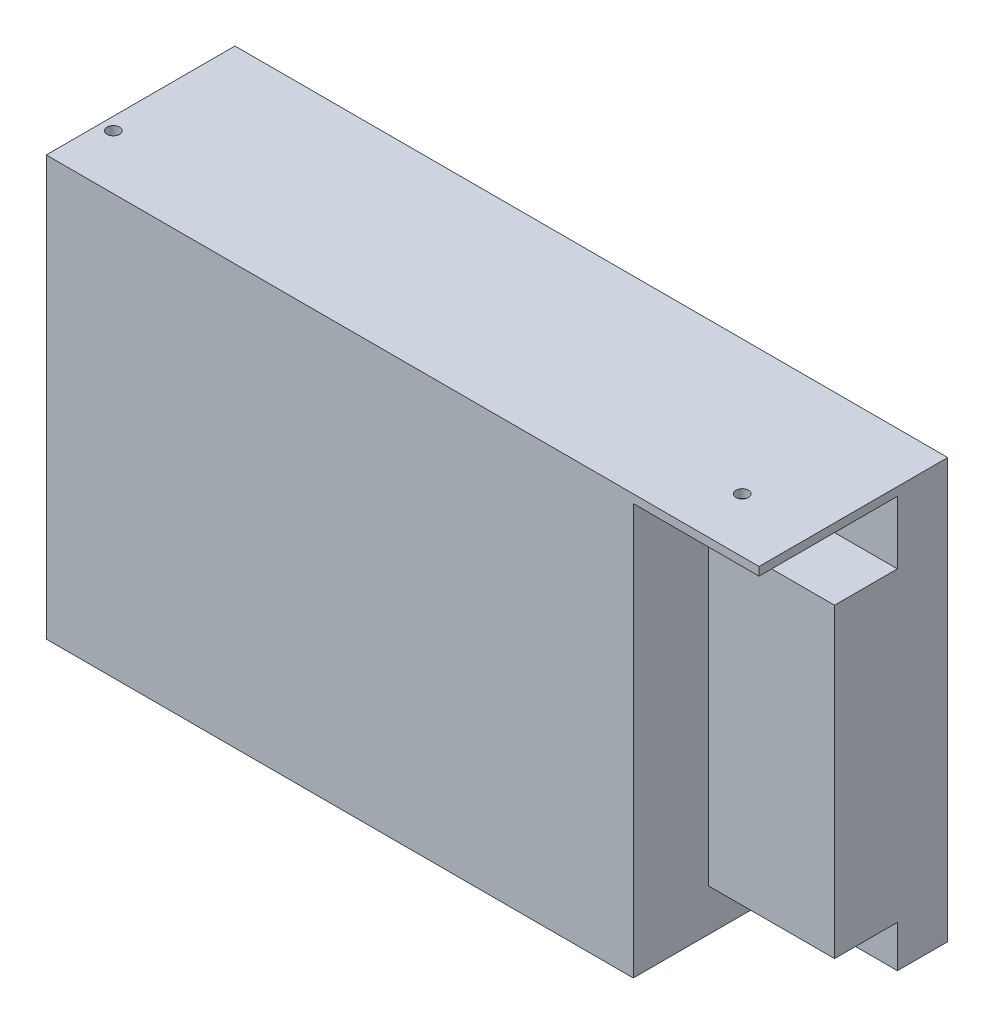
ISO-10303-21;
HEADER;
FILE_DESCRIPTION(('STEP AP214'),'2;1');
FILE_NAME('part.step','',(''),(''),'','','');
FILE_SCHEMA(('AUTOMOTIVE_DESIGN { 1 0 10303 214 1 1 1 1 }'));
ENDSEC;
DATA;
#1=APPLICATION_CONTEXT('core data for automotive mechanical design processes');
#2=APPLICATION_PROTOCOL_DEFINITION('international standard','automotive_design',2000,#1);
#3=PRODUCT_CONTEXT('',#1,'mechanical');
#4=PRODUCT('Part','Part','',(#3));
#5=PRODUCT_RELATED_PRODUCT_CATEGORY('part','',(#4));
#6=PRODUCT_DEFINITION_FORMATION('','',#4);
#7=PRODUCT_DEFINITION_CONTEXT('part definition',#1,'design');
#8=PRODUCT_DEFINITION('design','',#6,#7);
#9=PRODUCT_DEFINITION_SHAPE('','',#8);
#10=(LENGTH_UNIT() NAMED_UNIT(*) SI_UNIT(.MILLI.,.METRE.));
#11=(NAMED_UNIT(*) PLANE_ANGLE_UNIT() SI_UNIT($,.RADIAN.));
#12=(NAMED_UNIT(*) SI_UNIT($,.STERADIAN.) SOLID_ANGLE_UNIT());
#13=UNCERTAINTY_MEASURE_WITH_UNIT(LENGTH_MEASURE(1.E-05),#10,'distance_accuracy_value','');
#14=(GEOMETRIC_REPRESENTATION_CONTEXT(3) GLOBAL_UNCERTAINTY_ASSIGNED_CONTEXT((#13)) GLOBAL_UNIT_ASSIGNED_CONTEXT((#10,
#11,#12)) REPRESENTATION_CONTEXT('',''));
#15=CARTESIAN_POINT('',(0.,0.,0.));
#16=DIRECTION('',(0.,0.,1.));
#17=DIRECTION('',(1.,0.,0.));
#18=AXIS2_PLACEMENT_3D('',#15,#16,#17);
#19=CARTESIAN_POINT('',(-8.80074487895717,4.70111731843575,45.));
#20=DIRECTION('',(1.,0.,0.));
#21=DIRECTION('',(0.,1.,0.));
#22=AXIS2_PLACEMENT_3D('',#19,#20,#21);
#23=PLANE('',#22);
#24=DIRECTION('',(0.,-1.,0.));
#25=VECTOR('',#24,1.);
#26=CARTESIAN_POINT('',(-8.80074487895717,4.70111731843575,0.));
#27=LINE('',#26,#25);
#28=CARTESIAN_POINT('',(-8.80074487895717,4.70111731843575,0.));
#29=VERTEX_POINT('',#28);
#30=CARTESIAN_POINT('',(-8.80074487895716,-95.2988826815643,0.));
#31=VERTEX_POINT('',#30);
#32=EDGE_CURVE('E199',#29,#31,#27,.T.);
#33=ORIENTED_EDGE('',*,*,#32,.T.);
#34=DIRECTION('',(0.,0.,-1.));
#35=VECTOR('',#34,1.);
#36=CARTESIAN_POINT('',(-8.80074487895716,-95.2988826815643,45.));
#37=LINE('',#36,#35);
#38=CARTESIAN_POINT('',(-8.80074487895716,-95.2988826815643,45.));
#39=VERTEX_POINT('',#38);
#40=EDGE_CURVE('E11',#39,#31,#37,.T.);
#41=ORIENTED_EDGE('',*,*,#40,.F.);
#42=DIRECTION('',(0.,-1.,0.));
#43=VECTOR('',#42,1.);
#44=CARTESIAN_POINT('',(-8.80074487895717,4.70111731843575,45.));
#45=LINE('',#44,#43);
#46=CARTESIAN_POINT('',(-8.80074487895717,4.70111731843575,45.));
#47=VERTEX_POINT('',#46);
#48=EDGE_CURVE('E205',#47,#39,#45,.T.);
#49=ORIENTED_EDGE('',*,*,#48,.F.);
#50=DIRECTION('',(0.,0.,-1.));
#51=VECTOR('',#50,1.);
#52=CARTESIAN_POINT('',(-8.80074487895717,4.70111731843575,45.));
#53=LINE('',#52,#51);
#54=EDGE_CURVE('E220',#47,#29,#53,.T.);
#55=ORIENTED_EDGE('',*,*,#54,.T.);
#56=EDGE_LOOP('',(#33,#41,#49,#55));
#57=FACE_BOUND('',#56,.T.);
#58=ADVANCED_FACE('F41',(#57),#23,.F.);
#59=CARTESIAN_POINT('',(-8.80074487895716,-95.2988826815643,45.));
#60=DIRECTION('',(0.,1.,0.));
#61=DIRECTION('',(0.,0.,1.));
#62=AXIS2_PLACEMENT_3D('',#59,#60,#61);
#63=PLANE('',#62);
#64=DIRECTION('',(1.,0.,0.));
#65=VECTOR('',#64,1.);
#66=CARTESIAN_POINT('',(161.199255121043,-95.2988826815643,12.));
#67=LINE('',#66,#65);
#68=CARTESIAN_POINT('',(131.199255121043,-95.2988826815643,12.));
#69=VERTEX_POINT('',#68);
#70=CARTESIAN_POINT('',(161.199255121043,-95.2988826815643,12.));
#71=VERTEX_POINT('',#70);
#72=EDGE_CURVE('E138',#69,#71,#67,.T.);
#73=ORIENTED_EDGE('',*,*,#72,.F.);
#74=DIRECTION('',(0.,0.,1.));
#75=VECTOR('',#74,1.);
#76=CARTESIAN_POINT('',(131.199255121043,-95.2988826815643,27.));
#77=LINE('',#76,#75);
#78=CARTESIAN_POINT('',(131.199255121043,-95.2988826815643,45.));
#79=VERTEX_POINT('',#78);
#80=EDGE_CURVE('E195',#69,#79,#77,.T.);
#81=ORIENTED_EDGE('',*,*,#80,.T.);
#82=DIRECTION('',(1.,0.,0.));
#83=VECTOR('',#82,1.);
#84=CARTESIAN_POINT('',(-8.80074487895716,-95.2988826815643,45.));
#85=LINE('',#84,#83);
#86=EDGE_CURVE('E209',#39,#79,#85,.T.);
#87=ORIENTED_EDGE('',*,*,#86,.F.);
#88=ORIENTED_EDGE('',*,*,#40,.T.);
#89=DIRECTION('',(1.,0.,0.));
#90=VECTOR('',#89,1.);
#91=CARTESIAN_POINT('',(-8.80074487895716,-95.2988826815643,0.));
#92=LINE('',#91,#90);
#93=CARTESIAN_POINT('',(161.199255121043,-95.2988826815643,0.));
#94=VERTEX_POINT('',#93);
#95=EDGE_CURVE('E224',#31,#94,#92,.T.);
#96=ORIENTED_EDGE('',*,*,#95,.T.);
#97=DIRECTION('',(0.,0.,-1.));
#98=VECTOR('',#97,1.);
#99=CARTESIAN_POINT('',(161.199255121043,-95.2988826815643,45.));
#100=LINE('',#99,#98);
#101=EDGE_CURVE('E50',#71,#94,#100,.T.);
#102=ORIENTED_EDGE('',*,*,#101,.F.);
#103=EDGE_LOOP('',(#73,#81,#87,#88,#96,#102));
#104=FACE_BOUND('',#103,.T.);
#105=ADVANCED_FACE('F244',(#104),#63,.F.);
#106=CARTESIAN_POINT('',(161.199255121043,4.70111731843575,45.));
#107=DIRECTION('',(-1.,0.,0.));
#108=DIRECTION('',(0.,0.,1.));
#109=AXIS2_PLACEMENT_3D('',#106,#107,#108);
#110=PLANE('',#109);
#111=DIRECTION('',(0.,1.,0.));
#112=VECTOR('',#111,1.);
#113=CARTESIAN_POINT('',(161.199255121043,-95.2988826815643,27.));
#114=LINE('',#113,#112);
#115=CARTESIAN_POINT('',(161.199255121043,-85.2988826815643,27.));
#116=VERTEX_POINT('',#115);
#117=CARTESIAN_POINT('',(161.199255121043,-12.2988826815642,27.));
#118=VERTEX_POINT('',#117);
#119=EDGE_CURVE('E148',#116,#118,#114,.T.);
#120=ORIENTED_EDGE('',*,*,#119,.F.);
#121=DIRECTION('',(0.,0.,1.));
#122=VECTOR('',#121,1.);
#123=CARTESIAN_POINT('',(161.199255121043,-85.2988826815643,12.));
#124=LINE('',#123,#122);
#125=CARTESIAN_POINT('',(161.199255121043,-85.2988826815643,12.));
#126=VERTEX_POINT('',#125);
#127=EDGE_CURVE('E65',#126,#116,#124,.T.);
#128=ORIENTED_EDGE('',*,*,#127,.F.);
#129=DIRECTION('',(0.,1.,0.));
#130=VECTOR('',#129,1.);
#131=CARTESIAN_POINT('',(161.199255121043,-95.2988826815643,12.));
#132=LINE('',#131,#130);
#133=EDGE_CURVE('E133',#71,#126,#132,.T.);
#134=ORIENTED_EDGE('',*,*,#133,.F.);
#135=ORIENTED_EDGE('',*,*,#101,.T.);
#136=DIRECTION('',(0.,1.,0.));
#137=VECTOR('',#136,1.);
#138=CARTESIAN_POINT('',(161.199255121043,4.70111731843575,0.));
#139=LINE('',#138,#137);
#140=CARTESIAN_POINT('',(161.199255121043,4.70111731843575,0.));
#141=VERTEX_POINT('',#140);
#142=EDGE_CURVE('E228',#94,#141,#139,.T.);
#143=ORIENTED_EDGE('',*,*,#142,.T.);
#144=DIRECTION('',(0.,0.,-1.));
#145=VECTOR('',#144,1.);
#146=CARTESIAN_POINT('',(161.199255121043,4.70111731843575,45.));
#147=LINE('',#146,#145);
#148=CARTESIAN_POINT('',(161.199255121043,4.70111731843575,45.));
#149=VERTEX_POINT('',#148);
#150=EDGE_CURVE('E236',#149,#141,#147,.T.);
#151=ORIENTED_EDGE('',*,*,#150,.F.);
#152=DIRECTION('',(0.,1.,0.));
#153=VECTOR('',#152,1.);
#154=CARTESIAN_POINT('',(161.199255121043,4.70111731843575,45.));
#155=LINE('',#154,#153);
#156=CARTESIAN_POINT('',(161.199255121043,2.70111731843575,45.));
#157=VERTEX_POINT('',#156);
#158=EDGE_CURVE('E214',#157,#149,#155,.T.);
#159=ORIENTED_EDGE('',*,*,#158,.F.);
#160=DIRECTION('',(0.,0.,1.));
#161=VECTOR('',#160,1.);
#162=CARTESIAN_POINT('',(161.199255121043,2.70111731843575,27.));
#163=LINE('',#162,#161);
#164=CARTESIAN_POINT('',(161.199255121043,2.70111731843575,12.));
#165=VERTEX_POINT('',#164);
#166=EDGE_CURVE('E189',#165,#157,#163,.T.);
#167=ORIENTED_EDGE('',*,*,#166,.F.);
#168=DIRECTION('',(0.,1.,0.));
#169=VECTOR('',#168,1.);
#170=CARTESIAN_POINT('',(161.199255121043,2.70111731843575,12.));
#171=LINE('',#170,#169);
#172=CARTESIAN_POINT('',(161.199255121043,-12.2988826815642,12.));
#173=VERTEX_POINT('',#172);
#174=EDGE_CURVE('E167',#173,#165,#171,.T.);
#175=ORIENTED_EDGE('',*,*,#174,.F.);
#176=DIRECTION('',(0.,0.,1.));
#177=VECTOR('',#176,1.);
#178=CARTESIAN_POINT('',(161.199255121043,-12.2988826815642,12.));
#179=LINE('',#178,#177);
#180=EDGE_CURVE('E177',#173,#118,#179,.T.);
#181=ORIENTED_EDGE('',*,*,#180,.T.);
#182=EDGE_LOOP('',(#120,#128,#134,#135,#143,#151,#159,#167,#175,#181));
#183=FACE_BOUND('',#182,.T.);
#184=ADVANCED_FACE('F145',(#183),#110,.F.);
#185=CARTESIAN_POINT('',(-8.80074487895717,4.70111731843575,45.));
#186=DIRECTION('',(0.,-1.,0.));
#187=DIRECTION('',(0.,0.,-1.));
#188=AXIS2_PLACEMENT_3D('',#185,#186,#187);
#189=PLANE('',#188);
#190=CARTESIAN_POINT('',(-5.80074487895717,4.70111731843575,32.));
#191=DIRECTION('',(0.,1.,0.));
#192=DIRECTION('',(0.,0.,1.));
#193=AXIS2_PLACEMENT_3D('',#190,#191,#192);
#194=CIRCLE('',#193,1.5);
#195=CARTESIAN_POINT('',(-5.80074487895717,4.70111731843575,33.5));
#196=VERTEX_POINT('',#195);
#197=EDGE_CURVE('E282',#196,#196,#194,.T.);
#198=ORIENTED_EDGE('',*,*,#197,.F.);
#199=EDGE_LOOP('',(#198));
#200=FACE_BOUND('',#199,.T.);
#201=CARTESIAN_POINT('',(144.199255121043,4.70111731843575,32.));
#202=DIRECTION('',(0.,1.,0.));
#203=DIRECTION('',(0.,0.,1.));
#204=AXIS2_PLACEMENT_3D('',#201,#202,#203);
#205=CIRCLE('',#204,1.5);
#206=CARTESIAN_POINT('',(144.199255121043,4.70111731843575,33.5));
#207=VERTEX_POINT('',#206);
#208=EDGE_CURVE('E278',#207,#207,#205,.T.);
#209=ORIENTED_EDGE('',*,*,#208,.F.);
#210=EDGE_LOOP('',(#209));
#211=FACE_BOUND('',#210,.T.);
#212=DIRECTION('',(-1.,0.,0.));
#213=VECTOR('',#212,1.);
#214=CARTESIAN_POINT('',(-8.80074487895717,4.70111731843575,0.));
#215=LINE('',#214,#213);
#216=EDGE_CURVE('E210',#141,#29,#215,.T.);
#217=ORIENTED_EDGE('',*,*,#216,.T.);
#218=ORIENTED_EDGE('',*,*,#54,.F.);
#219=DIRECTION('',(-1.,0.,0.));
#220=VECTOR('',#219,1.);
#221=CARTESIAN_POINT('',(-8.80074487895717,4.70111731843575,45.));
#222=LINE('',#221,#220);
#223=EDGE_CURVE('E217',#149,#47,#222,.T.);
#224=ORIENTED_EDGE('',*,*,#223,.F.);
#225=ORIENTED_EDGE('',*,*,#150,.T.);
#226=EDGE_LOOP('',(#217,#218,#224,#225));
#227=FACE_BOUND('',#226,.T.);
#228=ADVANCED_FACE('F252',(#200,#211,#227),#189,.F.);
#229=CARTESIAN_POINT('',(0.,0.,45.));
#230=DIRECTION('',(0.,0.,1.));
#231=DIRECTION('',(1.,0.,0.));
#232=AXIS2_PLACEMENT_3D('',#229,#230,#231);
#233=PLANE('',#232);
#234=DIRECTION('',(0.,-1.,0.));
#235=VECTOR('',#234,1.);
#236=CARTESIAN_POINT('',(131.199255121043,-95.2988826815643,45.));
#237=LINE('',#236,#235);
#238=CARTESIAN_POINT('',(131.199255121043,2.70111731843575,45.));
#239=VERTEX_POINT('',#238);
#240=EDGE_CURVE('E185',#239,#79,#237,.T.);
#241=ORIENTED_EDGE('',*,*,#240,.F.);
#242=DIRECTION('',(-1.,0.,0.));
#243=VECTOR('',#242,1.);
#244=CARTESIAN_POINT('',(161.199255121043,2.70111731843575,45.));
#245=LINE('',#244,#243);
#246=EDGE_CURVE('E153',#157,#239,#245,.T.);
#247=ORIENTED_EDGE('',*,*,#246,.F.);
#248=ORIENTED_EDGE('',*,*,#158,.T.);
#249=ORIENTED_EDGE('',*,*,#223,.T.);
#250=ORIENTED_EDGE('',*,*,#48,.T.);
#251=ORIENTED_EDGE('',*,*,#86,.T.);
#252=EDGE_LOOP('',(#241,#247,#248,#249,#250,#251));
#253=FACE_BOUND('',#252,.T.);
#254=ADVANCED_FACE('F258',(#253),#233,.T.);
#255=CARTESIAN_POINT('',(0.,0.,0.));
#256=DIRECTION('',(0.,0.,1.));
#257=DIRECTION('',(1.,0.,0.));
#258=AXIS2_PLACEMENT_3D('',#255,#256,#257);
#259=PLANE('',#258);
#260=ORIENTED_EDGE('',*,*,#32,.F.);
#261=ORIENTED_EDGE('',*,*,#216,.F.);
#262=ORIENTED_EDGE('',*,*,#142,.F.);
#263=ORIENTED_EDGE('',*,*,#95,.F.);
#264=EDGE_LOOP('',(#260,#261,#262,#263));
#265=FACE_BOUND('',#264,.T.);
#266=ADVANCED_FACE('F249',(#265),#259,.F.);
#267=CARTESIAN_POINT('',(131.199255121043,-95.2988826815643,27.));
#268=DIRECTION('',(-1.,0.,0.));
#269=DIRECTION('',(0.,0.,1.));
#270=AXIS2_PLACEMENT_3D('',#267,#268,#269);
#271=PLANE('',#270);
#272=ORIENTED_EDGE('',*,*,#240,.T.);
#273=ORIENTED_EDGE('',*,*,#80,.F.);
#274=DIRECTION('',(0.,-1.,0.));
#275=VECTOR('',#274,1.);
#276=CARTESIAN_POINT('',(131.199255121043,-95.2988826815643,12.));
#277=LINE('',#276,#275);
#278=CARTESIAN_POINT('',(131.199255121043,-85.2988826815643,12.));
#279=VERTEX_POINT('',#278);
#280=EDGE_CURVE('E132',#279,#69,#277,.T.);
#281=ORIENTED_EDGE('',*,*,#280,.F.);
#282=DIRECTION('',(0.,0.,1.));
#283=VECTOR('',#282,1.);
#284=CARTESIAN_POINT('',(131.199255121043,-85.2988826815643,12.));
#285=LINE('',#284,#283);
#286=CARTESIAN_POINT('',(131.199255121043,-85.2988826815643,27.));
#287=VERTEX_POINT('',#286);
#288=EDGE_CURVE('E127',#279,#287,#285,.T.);
#289=ORIENTED_EDGE('',*,*,#288,.T.);
#290=DIRECTION('',(0.,-1.,0.));
#291=VECTOR('',#290,1.);
#292=CARTESIAN_POINT('',(131.199255121043,-95.2988826815643,27.));
#293=LINE('',#292,#291);
#294=CARTESIAN_POINT('',(131.199255121043,-12.2988826815642,27.));
#295=VERTEX_POINT('',#294);
#296=EDGE_CURVE('E184',#295,#287,#293,.T.);
#297=ORIENTED_EDGE('',*,*,#296,.F.);
#298=DIRECTION('',(0.,0.,1.));
#299=VECTOR('',#298,1.);
#300=CARTESIAN_POINT('',(131.199255121043,-12.2988826815642,12.));
#301=LINE('',#300,#299);
#302=CARTESIAN_POINT('',(131.199255121043,-12.2988826815642,12.));
#303=VERTEX_POINT('',#302);
#304=EDGE_CURVE('E57',#303,#295,#301,.T.);
#305=ORIENTED_EDGE('',*,*,#304,.F.);
#306=DIRECTION('',(0.,-1.,0.));
#307=VECTOR('',#306,1.);
#308=CARTESIAN_POINT('',(131.199255121043,2.70111731843575,12.));
#309=LINE('',#308,#307);
#310=CARTESIAN_POINT('',(131.199255121043,2.70111731843575,12.));
#311=VERTEX_POINT('',#310);
#312=EDGE_CURVE('E158',#311,#303,#309,.T.);
#313=ORIENTED_EDGE('',*,*,#312,.F.);
#314=DIRECTION('',(0.,0.,1.));
#315=VECTOR('',#314,1.);
#316=CARTESIAN_POINT('',(131.199255121043,2.70111731843575,27.));
#317=LINE('',#316,#315);
#318=EDGE_CURVE('E200',#311,#239,#317,.T.);
#319=ORIENTED_EDGE('',*,*,#318,.T.);
#320=EDGE_LOOP('',(#272,#273,#281,#289,#297,#305,#313,#319));
#321=FACE_BOUND('',#320,.T.);
#322=ADVANCED_FACE('F269',(#321),#271,.F.);
#323=CARTESIAN_POINT('',(161.199255121043,2.70111731843575,27.));
#324=DIRECTION('',(0.,1.,0.));
#325=DIRECTION('',(-1.,0.,0.));
#326=AXIS2_PLACEMENT_3D('',#323,#324,#325);
#327=PLANE('',#326);
#328=CARTESIAN_POINT('',(144.199255121043,2.70111731843575,32.));
#329=DIRECTION('',(0.,1.,0.));
#330=DIRECTION('',(-1.,0.,0.));
#331=AXIS2_PLACEMENT_3D('',#328,#329,#330);
#332=CIRCLE('',#331,1.5);
#333=CARTESIAN_POINT('',(142.699255121043,2.70111731843575,32.));
#334=VERTEX_POINT('',#333);
#335=EDGE_CURVE('E44',#334,#334,#332,.T.);
#336=ORIENTED_EDGE('',*,*,#335,.T.);
#337=EDGE_LOOP('',(#336));
#338=FACE_BOUND('',#337,.T.);
#339=ORIENTED_EDGE('',*,*,#246,.T.);
#340=ORIENTED_EDGE('',*,*,#318,.F.);
#341=DIRECTION('',(-1.,0.,0.));
#342=VECTOR('',#341,1.);
#343=CARTESIAN_POINT('',(131.199255121043,2.70111731843575,12.));
#344=LINE('',#343,#342);
#345=EDGE_CURVE('E171',#165,#311,#344,.T.);
#346=ORIENTED_EDGE('',*,*,#345,.F.);
#347=ORIENTED_EDGE('',*,*,#166,.T.);
#348=EDGE_LOOP('',(#339,#340,#346,#347));
#349=FACE_BOUND('',#348,.T.);
#350=ADVANCED_FACE('F266',(#338,#349),#327,.F.);
#351=CARTESIAN_POINT('',(0.,0.,27.));
#352=DIRECTION('',(0.,0.,1.));
#353=DIRECTION('',(1.,0.,0.));
#354=AXIS2_PLACEMENT_3D('',#351,#352,#353);
#355=PLANE('',#354);
#356=DIRECTION('',(-1.,0.,0.));
#357=VECTOR('',#356,1.);
#358=CARTESIAN_POINT('',(161.199255121043,-85.2988826815643,27.));
#359=LINE('',#358,#357);
#360=EDGE_CURVE('E142',#116,#287,#359,.T.);
#361=ORIENTED_EDGE('',*,*,#360,.F.);
#362=ORIENTED_EDGE('',*,*,#119,.T.);
#363=DIRECTION('',(1.,0.,0.));
#364=VECTOR('',#363,1.);
#365=CARTESIAN_POINT('',(131.199255121043,-12.2988826815642,27.));
#366=LINE('',#365,#364);
#367=EDGE_CURVE('E163',#295,#118,#366,.T.);
#368=ORIENTED_EDGE('',*,*,#367,.F.);
#369=ORIENTED_EDGE('',*,*,#296,.T.);
#370=EDGE_LOOP('',(#361,#362,#368,#369));
#371=FACE_BOUND('',#370,.T.);
#372=ADVANCED_FACE('F273',(#371),#355,.T.);
#373=CARTESIAN_POINT('',(131.199255121043,-12.2988826815642,12.));
#374=DIRECTION('',(0.,-1.,0.));
#375=DIRECTION('',(0.,0.,-1.));
#376=AXIS2_PLACEMENT_3D('',#373,#374,#375);
#377=PLANE('',#376);
#378=ORIENTED_EDGE('',*,*,#367,.T.);
#379=ORIENTED_EDGE('',*,*,#180,.F.);
#380=DIRECTION('',(1.,0.,0.));
#381=VECTOR('',#380,1.);
#382=CARTESIAN_POINT('',(131.199255121043,-12.2988826815642,12.));
#383=LINE('',#382,#381);
#384=EDGE_CURVE('E162',#303,#173,#383,.T.);
#385=ORIENTED_EDGE('',*,*,#384,.F.);
#386=ORIENTED_EDGE('',*,*,#304,.T.);
#387=EDGE_LOOP('',(#378,#379,#385,#386));
#388=FACE_BOUND('',#387,.T.);
#389=ADVANCED_FACE('F271',(#388),#377,.F.);
#390=CARTESIAN_POINT('',(0.,0.,12.));
#391=DIRECTION('',(0.,0.,1.));
#392=DIRECTION('',(1.,0.,0.));
#393=AXIS2_PLACEMENT_3D('',#390,#391,#392);
#394=PLANE('',#393);
#395=ORIENTED_EDGE('',*,*,#312,.T.);
#396=ORIENTED_EDGE('',*,*,#384,.T.);
#397=ORIENTED_EDGE('',*,*,#174,.T.);
#398=ORIENTED_EDGE('',*,*,#345,.T.);
#399=EDGE_LOOP('',(#395,#396,#397,#398));
#400=FACE_BOUND('',#399,.T.);
#401=ADVANCED_FACE('F265',(#400),#394,.T.);
#402=CARTESIAN_POINT('',(161.199255121043,-85.2988826815643,12.));
#403=DIRECTION('',(0.,1.,0.));
#404=DIRECTION('',(-1.,0.,0.));
#405=AXIS2_PLACEMENT_3D('',#402,#403,#404);
#406=PLANE('',#405);
#407=ORIENTED_EDGE('',*,*,#360,.T.);
#408=ORIENTED_EDGE('',*,*,#288,.F.);
#409=DIRECTION('',(-1.,0.,0.));
#410=VECTOR('',#409,1.);
#411=CARTESIAN_POINT('',(161.199255121043,-85.2988826815643,12.));
#412=LINE('',#411,#410);
#413=EDGE_CURVE('E124',#126,#279,#412,.T.);
#414=ORIENTED_EDGE('',*,*,#413,.F.);
#415=ORIENTED_EDGE('',*,*,#127,.T.);
#416=EDGE_LOOP('',(#407,#408,#414,#415));
#417=FACE_BOUND('',#416,.T.);
#418=ADVANCED_FACE('F126',(#417),#406,.F.);
#419=CARTESIAN_POINT('',(0.,0.,12.));
#420=DIRECTION('',(0.,0.,1.));
#421=DIRECTION('',(1.,0.,0.));
#422=AXIS2_PLACEMENT_3D('',#419,#420,#421);
#423=PLANE('',#422);
#424=ORIENTED_EDGE('',*,*,#133,.T.);
#425=ORIENTED_EDGE('',*,*,#413,.T.);
#426=ORIENTED_EDGE('',*,*,#280,.T.);
#427=ORIENTED_EDGE('',*,*,#72,.T.);
#428=EDGE_LOOP('',(#424,#425,#426,#427));
#429=FACE_BOUND('',#428,.T.);
#430=ADVANCED_FACE('F136',(#429),#423,.T.);
#431=CARTESIAN_POINT('',(144.199255121043,1.70111731843575,32.));
#432=DIRECTION('',(0.,1.,0.));
#433=DIRECTION('',(0.,0.,1.));
#434=AXIS2_PLACEMENT_3D('',#431,#432,#433);
#435=CYLINDRICAL_SURFACE('',#434,1.5);
#436=ORIENTED_EDGE('',*,*,#208,.T.);
#437=EDGE_LOOP('',(#436));
#438=FACE_BOUND('',#437,.T.);
#439=ORIENTED_EDGE('',*,*,#335,.F.);
#440=EDGE_LOOP('',(#439));
#441=FACE_BOUND('',#440,.T.);
#442=ADVANCED_FACE('F296',(#438,#441),#435,.F.);
#443=CARTESIAN_POINT('',(-5.80074487895717,1.70111731843575,32.));
#444=DIRECTION('',(0.,1.,0.));
#445=DIRECTION('',(0.,0.,1.));
#446=AXIS2_PLACEMENT_3D('',#443,#444,#445);
#447=CYLINDRICAL_SURFACE('',#446,1.5);
#448=CARTESIAN_POINT('',(-5.80074487895717,1.70111731843575,32.));
#449=DIRECTION('',(0.,1.,0.));
#450=DIRECTION('',(0.,0.,1.));
#451=AXIS2_PLACEMENT_3D('',#448,#449,#450);
#452=CIRCLE('',#451,1.5);
#453=CARTESIAN_POINT('',(-5.80074487895717,1.70111731843575,33.5));
#454=VERTEX_POINT('',#453);
#455=EDGE_CURVE('E286',#454,#454,#452,.T.);
#456=ORIENTED_EDGE('',*,*,#455,.F.);
#457=EDGE_LOOP('',(#456));
#458=FACE_BOUND('',#457,.T.);
#459=ORIENTED_EDGE('',*,*,#197,.T.);
#460=EDGE_LOOP('',(#459));
#461=FACE_BOUND('',#460,.T.);
#462=ADVANCED_FACE('F298',(#458,#461),#447,.F.);
#463=CARTESIAN_POINT('',(-5.80074487895717,1.70111731843575,32.));
#464=DIRECTION('',(0.,1.,0.));
#465=DIRECTION('',(0.,0.,1.));
#466=AXIS2_PLACEMENT_3D('',#463,#464,#465);
#467=PLANE('',#466);
#468=ORIENTED_EDGE('',*,*,#455,.T.);
#469=EDGE_LOOP('',(#468));
#470=FACE_BOUND('',#469,.T.);
#471=ADVANCED_FACE('F305',(#470),#467,.T.);
#472=CLOSED_SHELL('',(#58,#105,#184,#228,#254,#266,#322,#350,#372,#389,#401,#418,#430,#442,#462,#471));
#473=MANIFOLD_SOLID_BREP('B2',#472);
#474=ADVANCED_BREP_SHAPE_REPRESENTATION('',(#18,#473),#14);
#475=SHAPE_DEFINITION_REPRESENTATION(#9,#474);
ENDSEC;
END-ISO-10303-21;
